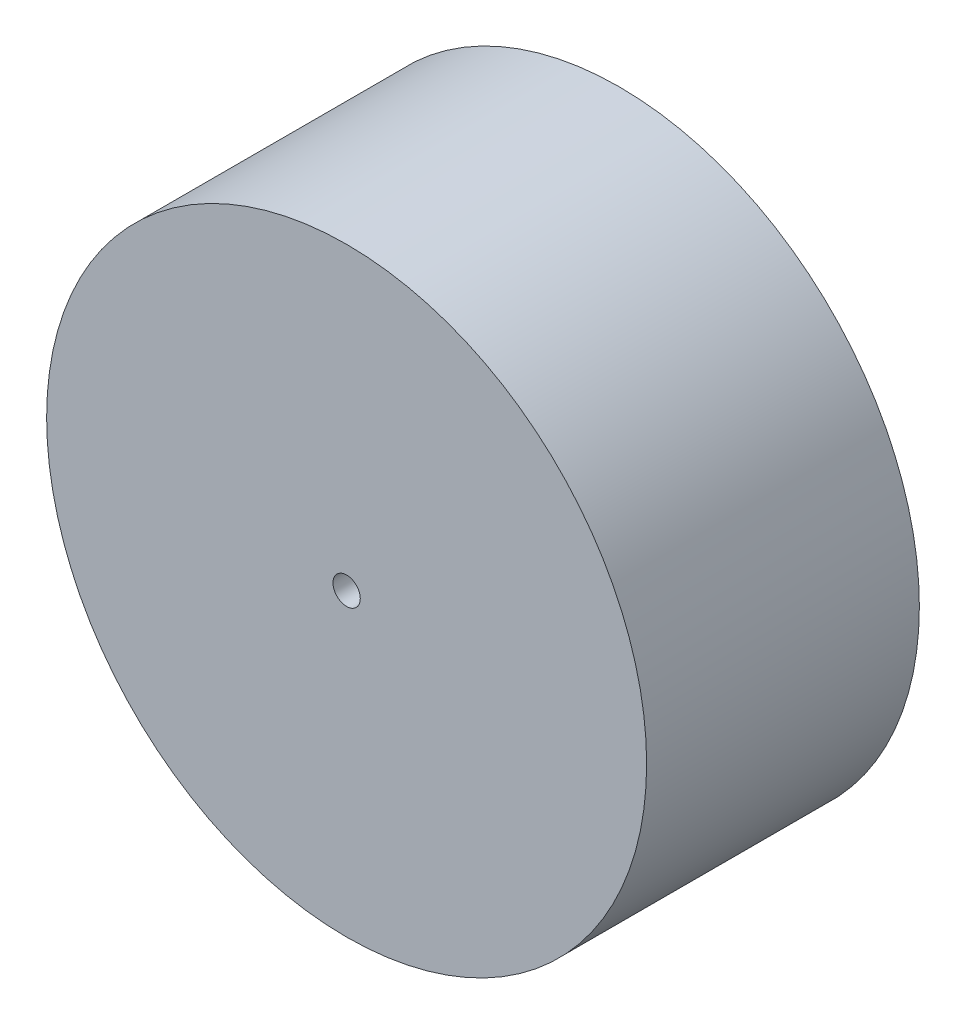
ISO-10303-21;
HEADER;
FILE_DESCRIPTION(('STEP AP214'),'2;1');
FILE_NAME('part.step','',(''),(''),'','','');
FILE_SCHEMA(('AUTOMOTIVE_DESIGN { 1 0 10303 214 1 1 1 1 }'));
ENDSEC;
DATA;
#1=APPLICATION_CONTEXT('core data for automotive mechanical design processes');
#2=APPLICATION_PROTOCOL_DEFINITION('international standard','automotive_design',2000,#1);
#3=PRODUCT_CONTEXT('',#1,'mechanical');
#4=PRODUCT('Part','Part','',(#3));
#5=PRODUCT_RELATED_PRODUCT_CATEGORY('part','',(#4));
#6=PRODUCT_DEFINITION_FORMATION('','',#4);
#7=PRODUCT_DEFINITION_CONTEXT('part definition',#1,'design');
#8=PRODUCT_DEFINITION('design','',#6,#7);
#9=PRODUCT_DEFINITION_SHAPE('','',#8);
#10=(LENGTH_UNIT() NAMED_UNIT(*) SI_UNIT(.MILLI.,.METRE.));
#11=(NAMED_UNIT(*) PLANE_ANGLE_UNIT() SI_UNIT($,.RADIAN.));
#12=(NAMED_UNIT(*) SI_UNIT($,.STERADIAN.) SOLID_ANGLE_UNIT());
#13=UNCERTAINTY_MEASURE_WITH_UNIT(LENGTH_MEASURE(1.E-05),#10,'distance_accuracy_value','');
#14=(GEOMETRIC_REPRESENTATION_CONTEXT(3) GLOBAL_UNCERTAINTY_ASSIGNED_CONTEXT((#13)) GLOBAL_UNIT_ASSIGNED_CONTEXT((#10,
#11,#12)) REPRESENTATION_CONTEXT('',''));
#15=CARTESIAN_POINT('',(0.,0.,0.));
#16=DIRECTION('',(0.,0.,1.));
#17=DIRECTION('',(1.,0.,0.));
#18=AXIS2_PLACEMENT_3D('',#15,#16,#17);
#19=CARTESIAN_POINT('',(0.,0.,-63.5));
#20=DIRECTION('',(0.,0.,1.));
#21=DIRECTION('',(1.,0.,0.));
#22=AXIS2_PLACEMENT_3D('',#19,#20,#21);
#23=CYLINDRICAL_SURFACE('',#22,139.7);
#24=CARTESIAN_POINT('',(0.,0.,-63.5));
#25=DIRECTION('',(0.,0.,1.));
#26=DIRECTION('',(1.,0.,0.));
#27=AXIS2_PLACEMENT_3D('',#24,#25,#26);
#28=CIRCLE('',#27,139.7);
#29=CARTESIAN_POINT('',(139.7,0.,-63.5));
#30=VERTEX_POINT('',#29);
#31=EDGE_CURVE('E10',#30,#30,#28,.T.);
#32=ORIENTED_EDGE('',*,*,#31,.T.);
#33=EDGE_LOOP('',(#32));
#34=FACE_BOUND('',#33,.T.);
#35=CARTESIAN_POINT('',(0.,0.,63.5));
#36=DIRECTION('',(0.,0.,1.));
#37=DIRECTION('',(1.,0.,0.));
#38=AXIS2_PLACEMENT_3D('',#35,#36,#37);
#39=CIRCLE('',#38,139.7);
#40=CARTESIAN_POINT('',(139.7,0.,63.5));
#41=VERTEX_POINT('',#40);
#42=EDGE_CURVE('E50',#41,#41,#39,.T.);
#43=ORIENTED_EDGE('',*,*,#42,.F.);
#44=EDGE_LOOP('',(#43));
#45=FACE_BOUND('',#44,.T.);
#46=ADVANCED_FACE('F43',(#34,#45),#23,.T.);
#47=CARTESIAN_POINT('',(0.,0.,-63.5));
#48=DIRECTION('',(0.,0.,1.));
#49=DIRECTION('',(1.,0.,0.));
#50=AXIS2_PLACEMENT_3D('',#47,#48,#49);
#51=PLANE('',#50);
#52=CARTESIAN_POINT('',(0.,0.,-63.5));
#53=DIRECTION('',(0.,0.,1.));
#54=DIRECTION('',(1.,0.,0.));
#55=AXIS2_PLACEMENT_3D('',#52,#53,#54);
#56=CIRCLE('',#55,6.35);
#57=CARTESIAN_POINT('',(6.35,0.,-63.5));
#58=VERTEX_POINT('',#57);
#59=EDGE_CURVE('E55',#58,#58,#56,.T.);
#60=ORIENTED_EDGE('',*,*,#59,.T.);
#61=EDGE_LOOP('',(#60));
#62=FACE_BOUND('',#61,.T.);
#63=ORIENTED_EDGE('',*,*,#31,.F.);
#64=EDGE_LOOP('',(#63));
#65=FACE_BOUND('',#64,.T.);
#66=ADVANCED_FACE('F71',(#62,#65),#51,.F.);
#67=CARTESIAN_POINT('',(0.,0.,63.5));
#68=DIRECTION('',(0.,0.,1.));
#69=DIRECTION('',(1.,0.,0.));
#70=AXIS2_PLACEMENT_3D('',#67,#68,#69);
#71=PLANE('',#70);
#72=CARTESIAN_POINT('',(0.,0.,63.5));
#73=DIRECTION('',(0.,0.,1.));
#74=DIRECTION('',(1.,0.,0.));
#75=AXIS2_PLACEMENT_3D('',#72,#73,#74);
#76=CIRCLE('',#75,6.35);
#77=CARTESIAN_POINT('',(6.35,0.,63.5));
#78=VERTEX_POINT('',#77);
#79=EDGE_CURVE('E60',#78,#78,#76,.T.);
#80=ORIENTED_EDGE('',*,*,#79,.F.);
#81=EDGE_LOOP('',(#80));
#82=FACE_BOUND('',#81,.T.);
#83=ORIENTED_EDGE('',*,*,#42,.T.);
#84=EDGE_LOOP('',(#83));
#85=FACE_BOUND('',#84,.T.);
#86=ADVANCED_FACE('F69',(#82,#85),#71,.T.);
#87=CARTESIAN_POINT('',(0.,0.,-63.5));
#88=DIRECTION('',(0.,0.,1.));
#89=DIRECTION('',(1.,0.,0.));
#90=AXIS2_PLACEMENT_3D('',#87,#88,#89);
#91=CYLINDRICAL_SURFACE('',#90,6.35);
#92=ORIENTED_EDGE('',*,*,#59,.F.);
#93=EDGE_LOOP('',(#92));
#94=FACE_BOUND('',#93,.T.);
#95=ORIENTED_EDGE('',*,*,#79,.T.);
#96=EDGE_LOOP('',(#95));
#97=FACE_BOUND('',#96,.T.);
#98=ADVANCED_FACE('F67',(#94,#97),#91,.F.);
#99=CLOSED_SHELL('',(#46,#66,#86,#98));
#100=MANIFOLD_SOLID_BREP('B2',#99);
#101=ADVANCED_BREP_SHAPE_REPRESENTATION('',(#18,#100),#14);
#102=SHAPE_DEFINITION_REPRESENTATION(#9,#101);
ENDSEC;
END-ISO-10303-21;
